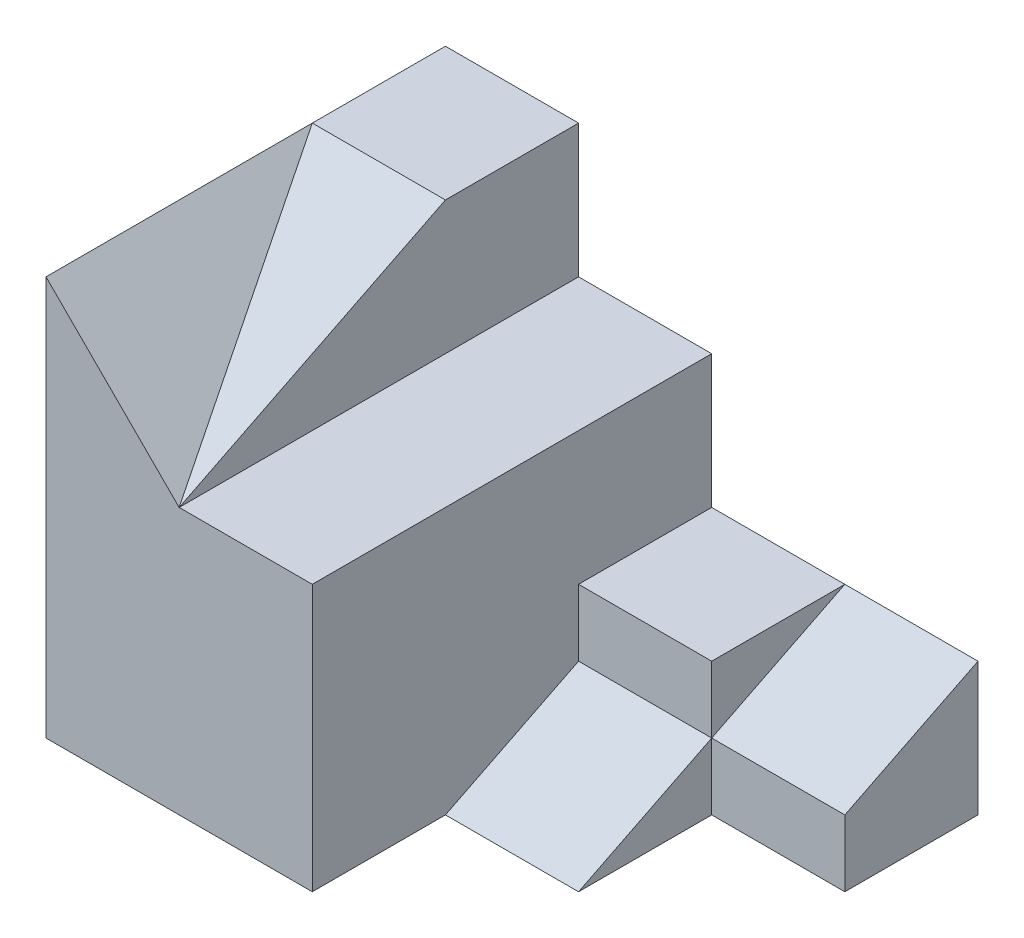
ISO-10303-21;
HEADER;
FILE_DESCRIPTION(('STEP AP214'),'2;1');
FILE_NAME('part.step','',(''),(''),'','','');
FILE_SCHEMA(('AUTOMOTIVE_DESIGN { 1 0 10303 214 1 1 1 1 }'));
ENDSEC;
DATA;
#1=APPLICATION_CONTEXT('core data for automotive mechanical design processes');
#2=APPLICATION_PROTOCOL_DEFINITION('international standard','automotive_design',2000,#1);
#3=PRODUCT_CONTEXT('',#1,'mechanical');
#4=PRODUCT('Part','Part','',(#3));
#5=PRODUCT_RELATED_PRODUCT_CATEGORY('part','',(#4));
#6=PRODUCT_DEFINITION_FORMATION('','',#4);
#7=PRODUCT_DEFINITION_CONTEXT('part definition',#1,'design');
#8=PRODUCT_DEFINITION('design','',#6,#7);
#9=PRODUCT_DEFINITION_SHAPE('','',#8);
#10=(LENGTH_UNIT() NAMED_UNIT(*) SI_UNIT(.MILLI.,.METRE.));
#11=(NAMED_UNIT(*) PLANE_ANGLE_UNIT() SI_UNIT($,.RADIAN.));
#12=(NAMED_UNIT(*) SI_UNIT($,.STERADIAN.) SOLID_ANGLE_UNIT());
#13=UNCERTAINTY_MEASURE_WITH_UNIT(LENGTH_MEASURE(1.E-05),#10,'distance_accuracy_value','');
#14=(GEOMETRIC_REPRESENTATION_CONTEXT(3) GLOBAL_UNCERTAINTY_ASSIGNED_CONTEXT((#13)) GLOBAL_UNIT_ASSIGNED_CONTEXT((#10,
#11,#12)) REPRESENTATION_CONTEXT('',''));
#15=CARTESIAN_POINT('',(0.,0.,0.));
#16=DIRECTION('',(0.,0.,1.));
#17=DIRECTION('',(1.,0.,0.));
#18=AXIS2_PLACEMENT_3D('',#15,#16,#17);
#19=CARTESIAN_POINT('',(20.,0.,-30.));
#20=DIRECTION('',(-1.,0.,0.));
#21=DIRECTION('',(0.,0.,1.));
#22=AXIS2_PLACEMENT_3D('',#19,#20,#21);
#23=PLANE('',#22);
#24=DIRECTION('',(0.,-1.,0.));
#25=VECTOR('',#24,1.);
#26=CARTESIAN_POINT('',(20.,5.,-20.));
#27=LINE('',#26,#25);
#28=CARTESIAN_POINT('',(20.,10.,-20.));
#29=VERTEX_POINT('',#28);
#30=CARTESIAN_POINT('',(20.,5.,-20.));
#31=VERTEX_POINT('',#30);
#32=EDGE_CURVE('E48',#29,#31,#27,.T.);
#33=ORIENTED_EDGE('',*,*,#32,.F.);
#34=DIRECTION('',(0.,0.,1.));
#35=VECTOR('',#34,1.);
#36=CARTESIAN_POINT('',(20.,10.,-20.));
#37=LINE('',#36,#35);
#38=CARTESIAN_POINT('',(20.,10.,-30.));
#39=VERTEX_POINT('',#38);
#40=EDGE_CURVE('E156',#39,#29,#37,.T.);
#41=ORIENTED_EDGE('',*,*,#40,.F.);
#42=DIRECTION('',(0.,-1.,0.));
#43=VECTOR('',#42,1.);
#44=CARTESIAN_POINT('',(20.,0.,-30.));
#45=LINE('',#44,#43);
#46=CARTESIAN_POINT('',(20.,20.,-30.));
#47=VERTEX_POINT('',#46);
#48=EDGE_CURVE('E134',#47,#39,#45,.T.);
#49=ORIENTED_EDGE('',*,*,#48,.F.);
#50=DIRECTION('',(0.,0.,1.));
#51=VECTOR('',#50,1.);
#52=CARTESIAN_POINT('',(20.,20.,-30.));
#53=LINE('',#52,#51);
#54=CARTESIAN_POINT('',(20.,20.,0.));
#55=VERTEX_POINT('',#54);
#56=EDGE_CURVE('E218',#47,#55,#53,.T.);
#57=ORIENTED_EDGE('',*,*,#56,.T.);
#58=DIRECTION('',(0.,-1.,0.));
#59=VECTOR('',#58,1.);
#60=CARTESIAN_POINT('',(20.,0.,0.));
#61=LINE('',#60,#59);
#62=CARTESIAN_POINT('',(20.,0.,0.));
#63=VERTEX_POINT('',#62);
#64=EDGE_CURVE('E208',#55,#63,#61,.T.);
#65=ORIENTED_EDGE('',*,*,#64,.T.);
#66=DIRECTION('',(0.,0.,1.));
#67=VECTOR('',#66,1.);
#68=CARTESIAN_POINT('',(20.,0.,0.));
#69=LINE('',#68,#67);
#70=CARTESIAN_POINT('',(20.,0.,-10.));
#71=VERTEX_POINT('',#70);
#72=EDGE_CURVE('E194',#71,#63,#69,.T.);
#73=ORIENTED_EDGE('',*,*,#72,.F.);
#74=DIRECTION('',(0.,0.447213595499958,-0.894427190999916));
#75=VECTOR('',#74,1.);
#76=CARTESIAN_POINT('',(20.,-4.,-2.));
#77=LINE('',#76,#75);
#78=EDGE_CURVE('E162',#71,#31,#77,.T.);
#79=ORIENTED_EDGE('',*,*,#78,.T.);
#80=EDGE_LOOP('',(#33,#41,#49,#57,#65,#73,#79));
#81=FACE_BOUND('',#80,.T.);
#82=ADVANCED_FACE('F33',(#81),#23,.F.);
#83=CARTESIAN_POINT('',(20.,-4.,-2.));
#84=DIRECTION('',(0.,-0.894427190999916,-0.447213595499958));
#85=DIRECTION('',(0.,0.447213595499958,-0.894427190999916));
#86=AXIS2_PLACEMENT_3D('',#83,#84,#85);
#87=PLANE('',#86);
#88=DIRECTION('',(-1.,0.,0.));
#89=VECTOR('',#88,1.);
#90=CARTESIAN_POINT('',(30.,5.,-20.));
#91=LINE('',#90,#89);
#92=CARTESIAN_POINT('',(30.,5.,-20.));
#93=VERTEX_POINT('',#92);
#94=EDGE_CURVE('E56',#93,#31,#91,.T.);
#95=ORIENTED_EDGE('',*,*,#94,.T.);
#96=ORIENTED_EDGE('',*,*,#78,.F.);
#97=DIRECTION('',(-1.,0.,0.));
#98=VECTOR('',#97,1.);
#99=CARTESIAN_POINT('',(20.,0.,-10.));
#100=LINE('',#99,#98);
#101=CARTESIAN_POINT('',(30.,0.,-10.));
#102=VERTEX_POINT('',#101);
#103=EDGE_CURVE('E191',#102,#71,#100,.T.);
#104=ORIENTED_EDGE('',*,*,#103,.F.);
#105=DIRECTION('',(0.,-0.447213595499958,0.894427190999916));
#106=VECTOR('',#105,1.);
#107=CARTESIAN_POINT('',(30.,0.,-10.));
#108=LINE('',#107,#106);
#109=EDGE_CURVE('E168',#93,#102,#108,.T.);
#110=ORIENTED_EDGE('',*,*,#109,.F.);
#111=EDGE_LOOP('',(#95,#96,#104,#110));
#112=FACE_BOUND('',#111,.T.);
#113=ADVANCED_FACE('F268',(#112),#87,.F.);
#114=DIRECTION('',(0.,0.447213595499958,-0.894427190999916));
#115=VECTOR('',#114,1.);
#116=CARTESIAN_POINT('',(30.,-4.,-2.));
#117=LINE('',#116,#115);
#118=CARTESIAN_POINT('',(30.,10.,-30.));
#119=VERTEX_POINT('',#118);
#120=EDGE_CURVE('E11',#93,#119,#117,.T.);
#121=ORIENTED_EDGE('',*,*,#120,.F.);
#122=DIRECTION('',(-1.,0.,0.));
#123=VECTOR('',#122,1.);
#124=CARTESIAN_POINT('',(30.,5.,-20.));
#125=LINE('',#124,#123);
#126=CARTESIAN_POINT('',(40.,5.,-20.));
#127=VERTEX_POINT('',#126);
#128=EDGE_CURVE('E164',#127,#93,#125,.T.);
#129=ORIENTED_EDGE('',*,*,#128,.F.);
#130=DIRECTION('',(0.,0.447213595499958,-0.894427190999916));
#131=VECTOR('',#130,1.);
#132=CARTESIAN_POINT('',(40.,-4.,-2.));
#133=LINE('',#132,#131);
#134=CARTESIAN_POINT('',(40.,10.,-30.));
#135=VERTEX_POINT('',#134);
#136=EDGE_CURVE('E142',#127,#135,#133,.T.);
#137=ORIENTED_EDGE('',*,*,#136,.T.);
#138=DIRECTION('',(1.,0.,0.));
#139=VECTOR('',#138,1.);
#140=CARTESIAN_POINT('',(0.,10.,-30.));
#141=LINE('',#140,#139);
#142=EDGE_CURVE('E130',#119,#135,#141,.T.);
#143=ORIENTED_EDGE('',*,*,#142,.F.);
#144=EDGE_LOOP('',(#121,#129,#137,#143));
#145=FACE_BOUND('',#144,.T.);
#146=ADVANCED_FACE('F140',(#145),#87,.F.);
#147=CARTESIAN_POINT('',(0.,30.,-20.));
#148=DIRECTION('',(-0.707106781186547,-0.707106781186548,0.));
#149=DIRECTION('',(0.707106781186548,-0.707106781186547,0.));
#150=AXIS2_PLACEMENT_3D('',#147,#148,#149);
#151=PLANE('',#150);
#152=DIRECTION('',(-0.408248290463863,0.408248290463863,-0.816496580927726));
#153=VECTOR('',#152,1.);
#154=CARTESIAN_POINT('',(-3.11338998124983,33.1133899812499,-26.2267799624997));
#155=LINE('',#154,#153);
#156=CARTESIAN_POINT('',(10.,20.,0.));
#157=VERTEX_POINT('',#156);
#158=CARTESIAN_POINT('',(0.,30.,-20.));
#159=VERTEX_POINT('',#158);
#160=EDGE_CURVE('E171',#157,#159,#155,.T.);
#161=ORIENTED_EDGE('',*,*,#160,.T.);
#162=DIRECTION('',(0.,0.,1.));
#163=VECTOR('',#162,1.);
#164=CARTESIAN_POINT('',(0.,30.,-20.));
#165=LINE('',#164,#163);
#166=CARTESIAN_POINT('',(0.,30.,0.));
#167=VERTEX_POINT('',#166);
#168=EDGE_CURVE('E181',#159,#167,#165,.T.);
#169=ORIENTED_EDGE('',*,*,#168,.T.);
#170=DIRECTION('',(0.707106781186548,-0.707106781186547,0.));
#171=VECTOR('',#170,1.);
#172=CARTESIAN_POINT('',(0.,30.,0.));
#173=LINE('',#172,#171);
#174=EDGE_CURVE('E177',#167,#157,#173,.T.);
#175=ORIENTED_EDGE('',*,*,#174,.T.);
#176=EDGE_LOOP('',(#161,#169,#175));
#177=FACE_BOUND('',#176,.T.);
#178=ADVANCED_FACE('F257',(#177),#151,.F.);
#179=CARTESIAN_POINT('',(0.,0.,-30.));
#180=DIRECTION('',(-1.,0.,0.));
#181=DIRECTION('',(0.,0.,1.));
#182=AXIS2_PLACEMENT_3D('',#179,#180,#181);
#183=PLANE('',#182);
#184=DIRECTION('',(0.,-1.,0.));
#185=VECTOR('',#184,1.);
#186=CARTESIAN_POINT('',(0.,0.,0.));
#187=LINE('',#186,#185);
#188=CARTESIAN_POINT('',(0.,0.,0.));
#189=VERTEX_POINT('',#188);
#190=EDGE_CURVE('E217',#167,#189,#187,.T.);
#191=ORIENTED_EDGE('',*,*,#190,.F.);
#192=ORIENTED_EDGE('',*,*,#168,.F.);
#193=DIRECTION('',(0.,0.,1.));
#194=VECTOR('',#193,1.);
#195=CARTESIAN_POINT('',(0.,30.,-30.));
#196=LINE('',#195,#194);
#197=CARTESIAN_POINT('',(0.,30.,-30.));
#198=VERTEX_POINT('',#197);
#199=EDGE_CURVE('E41',#198,#159,#196,.T.);
#200=ORIENTED_EDGE('',*,*,#199,.F.);
#201=DIRECTION('',(0.,-1.,0.));
#202=VECTOR('',#201,1.);
#203=CARTESIAN_POINT('',(0.,0.,-30.));
#204=LINE('',#203,#202);
#205=CARTESIAN_POINT('',(0.,0.,-30.));
#206=VERTEX_POINT('',#205);
#207=EDGE_CURVE('E221',#198,#206,#204,.T.);
#208=ORIENTED_EDGE('',*,*,#207,.T.);
#209=DIRECTION('',(0.,0.,1.));
#210=VECTOR('',#209,1.);
#211=CARTESIAN_POINT('',(0.,0.,-30.));
#212=LINE('',#211,#210);
#213=EDGE_CURVE('E232',#206,#189,#212,.T.);
#214=ORIENTED_EDGE('',*,*,#213,.T.);
#215=EDGE_LOOP('',(#191,#192,#200,#208,#214));
#216=FACE_BOUND('',#215,.T.);
#217=ADVANCED_FACE('F35',(#216),#183,.T.);
#218=CARTESIAN_POINT('',(0.,30.,-30.));
#219=DIRECTION('',(0.,1.,0.));
#220=DIRECTION('',(0.,0.,1.));
#221=AXIS2_PLACEMENT_3D('',#218,#219,#220);
#222=PLANE('',#221);
#223=DIRECTION('',(-1.,0.,0.));
#224=VECTOR('',#223,1.);
#225=CARTESIAN_POINT('',(0.,30.,-20.));
#226=LINE('',#225,#224);
#227=CARTESIAN_POINT('',(10.,30.,-20.));
#228=VERTEX_POINT('',#227);
#229=EDGE_CURVE('E178',#228,#159,#226,.T.);
#230=ORIENTED_EDGE('',*,*,#229,.F.);
#231=DIRECTION('',(0.,0.,1.));
#232=VECTOR('',#231,1.);
#233=CARTESIAN_POINT('',(10.,30.,-30.));
#234=LINE('',#233,#232);
#235=CARTESIAN_POINT('',(10.,30.,-30.));
#236=VERTEX_POINT('',#235);
#237=EDGE_CURVE('E214',#236,#228,#234,.T.);
#238=ORIENTED_EDGE('',*,*,#237,.F.);
#239=DIRECTION('',(-1.,0.,0.));
#240=VECTOR('',#239,1.);
#241=CARTESIAN_POINT('',(0.,30.,-30.));
#242=LINE('',#241,#240);
#243=EDGE_CURVE('E230',#236,#198,#242,.T.);
#244=ORIENTED_EDGE('',*,*,#243,.T.);
#245=ORIENTED_EDGE('',*,*,#199,.T.);
#246=EDGE_LOOP('',(#230,#238,#244,#245));
#247=FACE_BOUND('',#246,.T.);
#248=ADVANCED_FACE('F278',(#247),#222,.T.);
#249=CARTESIAN_POINT('',(40.,0.,-30.));
#250=DIRECTION('',(1.,0.,0.));
#251=DIRECTION('',(0.,0.,-1.));
#252=AXIS2_PLACEMENT_3D('',#249,#250,#251);
#253=PLANE('',#252);
#254=ORIENTED_EDGE('',*,*,#136,.F.);
#255=DIRECTION('',(0.,1.,0.));
#256=VECTOR('',#255,1.);
#257=CARTESIAN_POINT('',(40.,0.,-20.));
#258=LINE('',#257,#256);
#259=CARTESIAN_POINT('',(40.,0.,-20.));
#260=VERTEX_POINT('',#259);
#261=EDGE_CURVE('E197',#260,#127,#258,.T.);
#262=ORIENTED_EDGE('',*,*,#261,.F.);
#263=DIRECTION('',(0.,0.,1.));
#264=VECTOR('',#263,1.);
#265=CARTESIAN_POINT('',(40.,0.,-30.));
#266=LINE('',#265,#264);
#267=CARTESIAN_POINT('',(40.,0.,-30.));
#268=VERTEX_POINT('',#267);
#269=EDGE_CURVE('E238',#268,#260,#266,.T.);
#270=ORIENTED_EDGE('',*,*,#269,.F.);
#271=DIRECTION('',(0.,1.,0.));
#272=VECTOR('',#271,1.);
#273=CARTESIAN_POINT('',(40.,0.,-30.));
#274=LINE('',#273,#272);
#275=EDGE_CURVE('E228',#268,#135,#274,.T.);
#276=ORIENTED_EDGE('',*,*,#275,.T.);
#277=EDGE_LOOP('',(#254,#262,#270,#276));
#278=FACE_BOUND('',#277,.T.);
#279=ADVANCED_FACE('F262',(#278),#253,.T.);
#280=CARTESIAN_POINT('',(0.,0.,-30.));
#281=DIRECTION('',(0.,-1.,0.));
#282=DIRECTION('',(0.,0.,-1.));
#283=AXIS2_PLACEMENT_3D('',#280,#281,#282);
#284=PLANE('',#283);
#285=ORIENTED_EDGE('',*,*,#72,.T.);
#286=DIRECTION('',(1.,0.,0.));
#287=VECTOR('',#286,1.);
#288=CARTESIAN_POINT('',(0.,0.,0.));
#289=LINE('',#288,#287);
#290=EDGE_CURVE('E225',#189,#63,#289,.T.);
#291=ORIENTED_EDGE('',*,*,#290,.F.);
#292=ORIENTED_EDGE('',*,*,#213,.F.);
#293=DIRECTION('',(1.,0.,0.));
#294=VECTOR('',#293,1.);
#295=CARTESIAN_POINT('',(0.,0.,-30.));
#296=LINE('',#295,#294);
#297=EDGE_CURVE('E224',#206,#268,#296,.T.);
#298=ORIENTED_EDGE('',*,*,#297,.T.);
#299=ORIENTED_EDGE('',*,*,#269,.T.);
#300=DIRECTION('',(-1.,0.,0.));
#301=VECTOR('',#300,1.);
#302=CARTESIAN_POINT('',(30.,0.,-20.));
#303=LINE('',#302,#301);
#304=CARTESIAN_POINT('',(30.,0.,-20.));
#305=VERTEX_POINT('',#304);
#306=EDGE_CURVE('E185',#260,#305,#303,.T.);
#307=ORIENTED_EDGE('',*,*,#306,.T.);
#308=DIRECTION('',(0.,0.,1.));
#309=VECTOR('',#308,1.);
#310=CARTESIAN_POINT('',(30.,0.,-10.));
#311=LINE('',#310,#309);
#312=EDGE_CURVE('E188',#305,#102,#311,.T.);
#313=ORIENTED_EDGE('',*,*,#312,.T.);
#314=ORIENTED_EDGE('',*,*,#103,.T.);
#315=EDGE_LOOP('',(#285,#291,#292,#298,#299,#307,#313,#314));
#316=FACE_BOUND('',#315,.T.);
#317=ADVANCED_FACE('F248',(#316),#284,.T.);
#318=CARTESIAN_POINT('',(0.,0.,-30.));
#319=DIRECTION('',(0.,0.,-1.));
#320=DIRECTION('',(-1.,0.,0.));
#321=AXIS2_PLACEMENT_3D('',#318,#319,#320);
#322=PLANE('',#321);
#323=EDGE_CURVE('E126',#39,#119,#141,.T.);
#324=ORIENTED_EDGE('',*,*,#323,.T.);
#325=ORIENTED_EDGE('',*,*,#142,.T.);
#326=ORIENTED_EDGE('',*,*,#275,.F.);
#327=ORIENTED_EDGE('',*,*,#297,.F.);
#328=ORIENTED_EDGE('',*,*,#207,.F.);
#329=ORIENTED_EDGE('',*,*,#243,.F.);
#330=DIRECTION('',(0.,-1.,0.));
#331=VECTOR('',#330,1.);
#332=CARTESIAN_POINT('',(10.,0.,-30.));
#333=LINE('',#332,#331);
#334=CARTESIAN_POINT('',(10.,20.,-30.));
#335=VERTEX_POINT('',#334);
#336=EDGE_CURVE('E204',#236,#335,#333,.T.);
#337=ORIENTED_EDGE('',*,*,#336,.T.);
#338=DIRECTION('',(1.,0.,0.));
#339=VECTOR('',#338,1.);
#340=CARTESIAN_POINT('',(0.,20.,-30.));
#341=LINE('',#340,#339);
#342=EDGE_CURVE('E207',#335,#47,#341,.T.);
#343=ORIENTED_EDGE('',*,*,#342,.T.);
#344=ORIENTED_EDGE('',*,*,#48,.T.);
#345=EDGE_LOOP('',(#324,#325,#326,#327,#328,#329,#337,#343,#344));
#346=FACE_BOUND('',#345,.T.);
#347=ADVANCED_FACE('F128',(#346),#322,.T.);
#348=CARTESIAN_POINT('',(0.,0.,0.));
#349=DIRECTION('',(0.,0.,-1.));
#350=DIRECTION('',(-1.,0.,0.));
#351=AXIS2_PLACEMENT_3D('',#348,#349,#350);
#352=PLANE('',#351);
#353=DIRECTION('',(1.,0.,0.));
#354=VECTOR('',#353,1.);
#355=CARTESIAN_POINT('',(0.,20.,0.));
#356=LINE('',#355,#354);
#357=EDGE_CURVE('E201',#157,#55,#356,.T.);
#358=ORIENTED_EDGE('',*,*,#357,.F.);
#359=ORIENTED_EDGE('',*,*,#174,.F.);
#360=ORIENTED_EDGE('',*,*,#190,.T.);
#361=ORIENTED_EDGE('',*,*,#290,.T.);
#362=ORIENTED_EDGE('',*,*,#64,.F.);
#363=EDGE_LOOP('',(#358,#359,#360,#361,#362));
#364=FACE_BOUND('',#363,.T.);
#365=ADVANCED_FACE('F254',(#364),#352,.F.);
#366=CARTESIAN_POINT('',(10.,0.,-30.));
#367=DIRECTION('',(-1.,0.,0.));
#368=DIRECTION('',(0.,-1.,0.));
#369=AXIS2_PLACEMENT_3D('',#366,#367,#368);
#370=PLANE('',#369);
#371=ORIENTED_EDGE('',*,*,#237,.T.);
#372=DIRECTION('',(0.,0.447213595499958,-0.894427190999916));
#373=VECTOR('',#372,1.);
#374=CARTESIAN_POINT('',(10.,33.7360679774998,-27.4721359549996));
#375=LINE('',#374,#373);
#376=EDGE_CURVE('E174',#157,#228,#375,.T.);
#377=ORIENTED_EDGE('',*,*,#376,.F.);
#378=DIRECTION('',(0.,0.,1.));
#379=VECTOR('',#378,1.);
#380=CARTESIAN_POINT('',(10.,20.,-30.));
#381=LINE('',#380,#379);
#382=EDGE_CURVE('E137',#335,#157,#381,.T.);
#383=ORIENTED_EDGE('',*,*,#382,.F.);
#384=ORIENTED_EDGE('',*,*,#336,.F.);
#385=EDGE_LOOP('',(#371,#377,#383,#384));
#386=FACE_BOUND('',#385,.T.);
#387=ADVANCED_FACE('F274',(#386),#370,.F.);
#388=CARTESIAN_POINT('',(0.,20.,-30.));
#389=DIRECTION('',(0.,-1.,0.));
#390=DIRECTION('',(0.,0.,-1.));
#391=AXIS2_PLACEMENT_3D('',#388,#389,#390);
#392=PLANE('',#391);
#393=ORIENTED_EDGE('',*,*,#357,.T.);
#394=ORIENTED_EDGE('',*,*,#56,.F.);
#395=ORIENTED_EDGE('',*,*,#342,.F.);
#396=ORIENTED_EDGE('',*,*,#382,.T.);
#397=EDGE_LOOP('',(#393,#394,#395,#396));
#398=FACE_BOUND('',#397,.T.);
#399=ADVANCED_FACE('F271',(#398),#392,.F.);
#400=CARTESIAN_POINT('',(30.,0.,-10.));
#401=DIRECTION('',(-1.,0.,0.));
#402=DIRECTION('',(0.,0.,1.));
#403=AXIS2_PLACEMENT_3D('',#400,#401,#402);
#404=PLANE('',#403);
#405=DIRECTION('',(0.,1.,0.));
#406=VECTOR('',#405,1.);
#407=CARTESIAN_POINT('',(30.,0.,-20.));
#408=LINE('',#407,#406);
#409=EDGE_CURVE('E198',#305,#93,#408,.T.);
#410=ORIENTED_EDGE('',*,*,#409,.T.);
#411=ORIENTED_EDGE('',*,*,#109,.T.);
#412=ORIENTED_EDGE('',*,*,#312,.F.);
#413=EDGE_LOOP('',(#410,#411,#412));
#414=FACE_BOUND('',#413,.T.);
#415=ADVANCED_FACE('F267',(#414),#404,.F.);
#416=CARTESIAN_POINT('',(30.,0.,-20.));
#417=DIRECTION('',(0.,0.,-1.));
#418=DIRECTION('',(-1.,0.,0.));
#419=AXIS2_PLACEMENT_3D('',#416,#417,#418);
#420=PLANE('',#419);
#421=ORIENTED_EDGE('',*,*,#261,.T.);
#422=ORIENTED_EDGE('',*,*,#128,.T.);
#423=ORIENTED_EDGE('',*,*,#409,.F.);
#424=ORIENTED_EDGE('',*,*,#306,.F.);
#425=EDGE_LOOP('',(#421,#422,#423,#424));
#426=FACE_BOUND('',#425,.T.);
#427=ADVANCED_FACE('F264',(#426),#420,.F.);
#428=CARTESIAN_POINT('',(0.,16.,8.00000000000001));
#429=DIRECTION('',(0.,-0.894427190999916,-0.447213595499958));
#430=DIRECTION('',(0.,0.447213595499958,-0.894427190999916));
#431=AXIS2_PLACEMENT_3D('',#428,#429,#430);
#432=PLANE('',#431);
#433=ORIENTED_EDGE('',*,*,#376,.T.);
#434=ORIENTED_EDGE('',*,*,#229,.T.);
#435=ORIENTED_EDGE('',*,*,#160,.F.);
#436=EDGE_LOOP('',(#433,#434,#435));
#437=FACE_BOUND('',#436,.T.);
#438=ADVANCED_FACE('F277',(#437),#432,.F.);
#439=CARTESIAN_POINT('',(30.,0.,0.));
#440=DIRECTION('',(-1.,0.,0.));
#441=DIRECTION('',(0.,0.,1.));
#442=AXIS2_PLACEMENT_3D('',#439,#440,#441);
#443=PLANE('',#442);
#444=DIRECTION('',(0.,-1.,0.));
#445=VECTOR('',#444,1.);
#446=CARTESIAN_POINT('',(30.,5.,-20.));
#447=LINE('',#446,#445);
#448=CARTESIAN_POINT('',(30.,10.,-20.));
#449=VERTEX_POINT('',#448);
#450=EDGE_CURVE('E150',#449,#93,#447,.T.);
#451=ORIENTED_EDGE('',*,*,#450,.T.);
#452=ORIENTED_EDGE('',*,*,#120,.T.);
#453=DIRECTION('',(0.,0.,1.));
#454=VECTOR('',#453,1.);
#455=CARTESIAN_POINT('',(30.,10.,-20.));
#456=LINE('',#455,#454);
#457=EDGE_CURVE('E147',#119,#449,#456,.T.);
#458=ORIENTED_EDGE('',*,*,#457,.T.);
#459=EDGE_LOOP('',(#451,#452,#458));
#460=FACE_BOUND('',#459,.T.);
#461=ADVANCED_FACE('F146',(#460),#443,.F.);
#462=CARTESIAN_POINT('',(30.,5.,-20.));
#463=DIRECTION('',(0.,0.,-1.));
#464=DIRECTION('',(-1.,0.,0.));
#465=AXIS2_PLACEMENT_3D('',#462,#463,#464);
#466=PLANE('',#465);
#467=ORIENTED_EDGE('',*,*,#32,.T.);
#468=ORIENTED_EDGE('',*,*,#94,.F.);
#469=ORIENTED_EDGE('',*,*,#450,.F.);
#470=DIRECTION('',(-1.,0.,0.));
#471=VECTOR('',#470,1.);
#472=CARTESIAN_POINT('',(30.,10.,-20.));
#473=LINE('',#472,#471);
#474=EDGE_CURVE('E153',#449,#29,#473,.T.);
#475=ORIENTED_EDGE('',*,*,#474,.T.);
#476=EDGE_LOOP('',(#467,#468,#469,#475));
#477=FACE_BOUND('',#476,.T.);
#478=ADVANCED_FACE('F338',(#477),#466,.F.);
#479=CARTESIAN_POINT('',(30.,10.,-20.));
#480=DIRECTION('',(0.,-1.,0.));
#481=DIRECTION('',(0.,0.,-1.));
#482=AXIS2_PLACEMENT_3D('',#479,#480,#481);
#483=PLANE('',#482);
#484=ORIENTED_EDGE('',*,*,#40,.T.);
#485=ORIENTED_EDGE('',*,*,#474,.F.);
#486=ORIENTED_EDGE('',*,*,#457,.F.);
#487=ORIENTED_EDGE('',*,*,#323,.F.);
#488=EDGE_LOOP('',(#484,#485,#486,#487));
#489=FACE_BOUND('',#488,.T.);
#490=ADVANCED_FACE('F151',(#489),#483,.F.);
#491=CLOSED_SHELL('',(#82,#113,#146,#178,#217,#248,#279,#317,#347,#365,#387,#399,#415,#427,#438,
#461,#478,#490));
#492=MANIFOLD_SOLID_BREP('B2',#491);
#493=ADVANCED_BREP_SHAPE_REPRESENTATION('',(#18,#492),#14);
#494=SHAPE_DEFINITION_REPRESENTATION(#9,#493);
ENDSEC;
END-ISO-10303-21;
